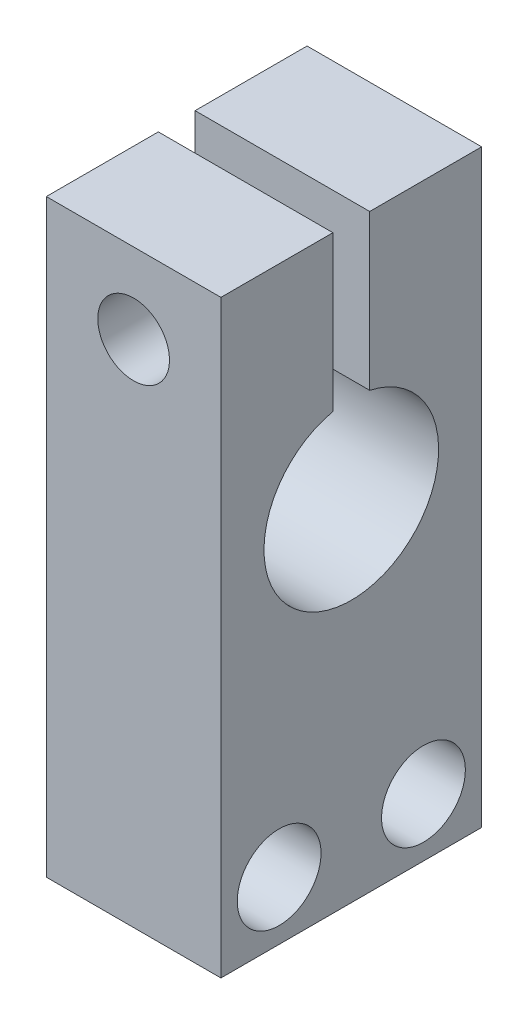
ISO-10303-21;
HEADER;
FILE_DESCRIPTION(('STEP AP214'),'2;1');
FILE_NAME('part.step','',(''),(''),'','','');
FILE_SCHEMA(('AUTOMOTIVE_DESIGN { 1 0 10303 214 1 1 1 1 }'));
ENDSEC;
DATA;
#1=APPLICATION_CONTEXT('core data for automotive mechanical design processes');
#2=APPLICATION_PROTOCOL_DEFINITION('international standard','automotive_design',2000,#1);
#3=PRODUCT_CONTEXT('',#1,'mechanical');
#4=PRODUCT('Part','Part','',(#3));
#5=PRODUCT_RELATED_PRODUCT_CATEGORY('part','',(#4));
#6=PRODUCT_DEFINITION_FORMATION('','',#4);
#7=PRODUCT_DEFINITION_CONTEXT('part definition',#1,'design');
#8=PRODUCT_DEFINITION('design','',#6,#7);
#9=PRODUCT_DEFINITION_SHAPE('','',#8);
#10=(LENGTH_UNIT() NAMED_UNIT(*) SI_UNIT(.MILLI.,.METRE.));
#11=(NAMED_UNIT(*) PLANE_ANGLE_UNIT() SI_UNIT($,.RADIAN.));
#12=(NAMED_UNIT(*) SI_UNIT($,.STERADIAN.) SOLID_ANGLE_UNIT());
#13=UNCERTAINTY_MEASURE_WITH_UNIT(LENGTH_MEASURE(1.E-05),#10,'distance_accuracy_value','');
#14=(GEOMETRIC_REPRESENTATION_CONTEXT(3) GLOBAL_UNCERTAINTY_ASSIGNED_CONTEXT((#13)) GLOBAL_UNIT_ASSIGNED_CONTEXT((#10,
#11,#12)) REPRESENTATION_CONTEXT('',''));
#15=CARTESIAN_POINT('',(0.,0.,0.));
#16=DIRECTION('',(0.,0.,1.));
#17=DIRECTION('',(1.,0.,0.));
#18=AXIS2_PLACEMENT_3D('',#15,#16,#17);
#19=CARTESIAN_POINT('',(-4.7625,13.1064,-15.875));
#20=DIRECTION('',(0.,1.,0.));
#21=DIRECTION('',(0.,0.,1.));
#22=AXIS2_PLACEMENT_3D('',#19,#20,#21);
#23=PLANE('',#22);
#24=DIRECTION('',(-1.,0.,0.));
#25=VECTOR('',#24,1.);
#26=CARTESIAN_POINT('',(4.7625,13.1064,7.112));
#27=LINE('',#26,#25);
#28=CARTESIAN_POINT('',(4.7625,13.1064,7.112));
#29=VERTEX_POINT('',#28);
#30=CARTESIAN_POINT('',(-4.7625,13.1064,7.112));
#31=VERTEX_POINT('',#30);
#32=EDGE_CURVE('E169',#29,#31,#27,.T.);
#33=ORIENTED_EDGE('',*,*,#32,.F.);
#34=DIRECTION('',(0.,0.,1.));
#35=VECTOR('',#34,1.);
#36=CARTESIAN_POINT('',(4.7625,13.1064,-15.875));
#37=LINE('',#36,#35);
#38=CARTESIAN_POINT('',(4.7625,13.1064,1.0033));
#39=VERTEX_POINT('',#38);
#40=EDGE_CURVE('E148',#39,#29,#37,.T.);
#41=ORIENTED_EDGE('',*,*,#40,.F.);
#42=DIRECTION('',(-1.,0.,0.));
#43=VECTOR('',#42,1.);
#44=CARTESIAN_POINT('',(4.7625,13.1064,1.0033));
#45=LINE('',#44,#43);
#46=CARTESIAN_POINT('',(-4.7625,13.1064,1.0033));
#47=VERTEX_POINT('',#46);
#48=EDGE_CURVE('E121',#39,#47,#45,.T.);
#49=ORIENTED_EDGE('',*,*,#48,.T.);
#50=DIRECTION('',(0.,0.,1.));
#51=VECTOR('',#50,1.);
#52=CARTESIAN_POINT('',(-4.7625,13.1064,-15.875));
#53=LINE('',#52,#51);
#54=EDGE_CURVE('E42',#47,#31,#53,.T.);
#55=ORIENTED_EDGE('',*,*,#54,.T.);
#56=EDGE_LOOP('',(#33,#41,#49,#55));
#57=FACE_BOUND('',#56,.T.);
#58=ADVANCED_FACE('F33',(#57),#23,.T.);
#59=CARTESIAN_POINT('',(-4.7625,-19.05,15.875));
#60=DIRECTION('',(0.,-1.,0.));
#61=DIRECTION('',(0.,0.,-1.));
#62=AXIS2_PLACEMENT_3D('',#59,#60,#61);
#63=PLANE('',#62);
#64=DIRECTION('',(1.,0.,0.));
#65=VECTOR('',#64,1.);
#66=CARTESIAN_POINT('',(-4.7625,-19.05,7.112));
#67=LINE('',#66,#65);
#68=CARTESIAN_POINT('',(-4.7625,-19.05,7.112));
#69=VERTEX_POINT('',#68);
#70=CARTESIAN_POINT('',(4.7625,-19.05,7.112));
#71=VERTEX_POINT('',#70);
#72=EDGE_CURVE('E50',#69,#71,#67,.T.);
#73=ORIENTED_EDGE('',*,*,#72,.F.);
#74=DIRECTION('',(0.,0.,-1.));
#75=VECTOR('',#74,1.);
#76=CARTESIAN_POINT('',(-4.7625,-19.05,15.875));
#77=LINE('',#76,#75);
#78=CARTESIAN_POINT('',(-4.7625,-19.05,-7.112));
#79=VERTEX_POINT('',#78);
#80=EDGE_CURVE('E147',#69,#79,#77,.T.);
#81=ORIENTED_EDGE('',*,*,#80,.T.);
#82=DIRECTION('',(-1.,0.,0.));
#83=VECTOR('',#82,1.);
#84=CARTESIAN_POINT('',(4.7625,-19.05,-7.112));
#85=LINE('',#84,#83);
#86=CARTESIAN_POINT('',(4.7625,-19.05,-7.112));
#87=VERTEX_POINT('',#86);
#88=EDGE_CURVE('E139',#87,#79,#85,.T.);
#89=ORIENTED_EDGE('',*,*,#88,.F.);
#90=DIRECTION('',(0.,0.,-1.));
#91=VECTOR('',#90,1.);
#92=CARTESIAN_POINT('',(4.7625,-19.05,15.875));
#93=LINE('',#92,#91);
#94=EDGE_CURVE('E144',#71,#87,#93,.T.);
#95=ORIENTED_EDGE('',*,*,#94,.F.);
#96=EDGE_LOOP('',(#73,#81,#89,#95));
#97=FACE_BOUND('',#96,.T.);
#98=ADVANCED_FACE('F35',(#97),#63,.T.);
#99=DIRECTION('',(-1.,0.,0.));
#100=VECTOR('',#99,1.);
#101=CARTESIAN_POINT('',(4.7625,13.1064,-1.0033));
#102=LINE('',#101,#100);
#103=CARTESIAN_POINT('',(4.7625,13.1064,-1.0033));
#104=VERTEX_POINT('',#103);
#105=CARTESIAN_POINT('',(-4.7625,13.1064,-1.0033));
#106=VERTEX_POINT('',#105);
#107=EDGE_CURVE('E133',#104,#106,#102,.T.);
#108=ORIENTED_EDGE('',*,*,#107,.F.);
#109=CARTESIAN_POINT('',(4.7625,13.1064,-7.112));
#110=VERTEX_POINT('',#109);
#111=EDGE_CURVE('E37',#110,#104,#37,.T.);
#112=ORIENTED_EDGE('',*,*,#111,.F.);
#113=DIRECTION('',(-1.,0.,0.));
#114=VECTOR('',#113,1.);
#115=CARTESIAN_POINT('',(4.7625,13.1064,-7.112));
#116=LINE('',#115,#114);
#117=CARTESIAN_POINT('',(-4.7625,13.1064,-7.112));
#118=VERTEX_POINT('',#117);
#119=EDGE_CURVE('E141',#110,#118,#116,.T.);
#120=ORIENTED_EDGE('',*,*,#119,.T.);
#121=EDGE_CURVE('E11',#118,#106,#53,.T.);
#122=ORIENTED_EDGE('',*,*,#121,.T.);
#123=EDGE_LOOP('',(#108,#112,#120,#122));
#124=FACE_BOUND('',#123,.T.);
#125=ADVANCED_FACE('F154',(#124),#23,.T.);
#126=CARTESIAN_POINT('',(-4.7625,0.,0.));
#127=DIRECTION('',(1.,0.,0.));
#128=DIRECTION('',(0.,0.,-1.));
#129=AXIS2_PLACEMENT_3D('',#126,#127,#128);
#130=PLANE('',#129);
#131=CARTESIAN_POINT('',(-4.7625,-15.875,-3.937));
#132=DIRECTION('',(1.,0.,0.));
#133=DIRECTION('',(0.,0.,-1.));
#134=AXIS2_PLACEMENT_3D('',#131,#132,#133);
#135=CIRCLE('',#134,2.286);
#136=CARTESIAN_POINT('',(-4.7625,-15.875,-6.223));
#137=VERTEX_POINT('',#136);
#138=EDGE_CURVE('E234',#137,#137,#135,.T.);
#139=ORIENTED_EDGE('',*,*,#138,.T.);
#140=EDGE_LOOP('',(#139));
#141=FACE_BOUND('',#140,.T.);
#142=CARTESIAN_POINT('',(-4.7625,-15.875,3.937));
#143=DIRECTION('',(1.,0.,0.));
#144=DIRECTION('',(0.,0.,-1.));
#145=AXIS2_PLACEMENT_3D('',#142,#143,#144);
#146=CIRCLE('',#145,2.286);
#147=CARTESIAN_POINT('',(-4.7625,-15.875,1.651));
#148=VERTEX_POINT('',#147);
#149=EDGE_CURVE('E244',#148,#148,#146,.T.);
#150=ORIENTED_EDGE('',*,*,#149,.T.);
#151=EDGE_LOOP('',(#150));
#152=FACE_BOUND('',#151,.T.);
#153=DIRECTION('',(0.,1.,0.));
#154=VECTOR('',#153,1.);
#155=CARTESIAN_POINT('',(-4.7625,4.65561976110591,1.0033));
#156=LINE('',#155,#154);
#157=CARTESIAN_POINT('',(-4.7625,4.65561976110591,1.0033));
#158=VERTEX_POINT('',#157);
#159=EDGE_CURVE('E126',#158,#47,#156,.T.);
#160=ORIENTED_EDGE('',*,*,#159,.F.);
#161=CARTESIAN_POINT('',(-4.7625,0.,0.));
#162=DIRECTION('',(1.,0.,0.));
#163=DIRECTION('',(0.,0.,-1.));
#164=AXIS2_PLACEMENT_3D('',#161,#162,#163);
#165=CIRCLE('',#164,4.7625);
#166=CARTESIAN_POINT('',(-4.7625,4.65561976110591,-1.0033));
#167=VERTEX_POINT('',#166);
#168=EDGE_CURVE('E101',#158,#167,#165,.T.);
#169=ORIENTED_EDGE('',*,*,#168,.T.);
#170=DIRECTION('',(0.,-1.,0.));
#171=VECTOR('',#170,1.);
#172=CARTESIAN_POINT('',(-4.7625,13.1064,-1.0033));
#173=LINE('',#172,#171);
#174=EDGE_CURVE('E122',#106,#167,#173,.T.);
#175=ORIENTED_EDGE('',*,*,#174,.F.);
#176=ORIENTED_EDGE('',*,*,#121,.F.);
#177=DIRECTION('',(0.,1.,0.));
#178=VECTOR('',#177,1.);
#179=CARTESIAN_POINT('',(-4.7625,-19.05,-7.112));
#180=LINE('',#179,#178);
#181=EDGE_CURVE('E105',#79,#118,#180,.T.);
#182=ORIENTED_EDGE('',*,*,#181,.F.);
#183=ORIENTED_EDGE('',*,*,#80,.F.);
#184=DIRECTION('',(0.,-1.,0.));
#185=VECTOR('',#184,1.);
#186=CARTESIAN_POINT('',(-4.7625,13.1064,7.112));
#187=LINE('',#186,#185);
#188=EDGE_CURVE('E163',#31,#69,#187,.T.);
#189=ORIENTED_EDGE('',*,*,#188,.F.);
#190=ORIENTED_EDGE('',*,*,#54,.F.);
#191=EDGE_LOOP('',(#160,#169,#175,#176,#182,#183,#189,#190));
#192=FACE_BOUND('',#191,.T.);
#193=ADVANCED_FACE('F160',(#141,#152,#192),#130,.F.);
#194=CARTESIAN_POINT('',(4.7625,0.,0.));
#195=DIRECTION('',(1.,0.,0.));
#196=DIRECTION('',(0.,0.,-1.));
#197=AXIS2_PLACEMENT_3D('',#194,#195,#196);
#198=PLANE('',#197);
#199=CARTESIAN_POINT('',(4.7625,-15.875,-3.937));
#200=DIRECTION('',(1.,0.,0.));
#201=DIRECTION('',(0.,0.,-1.));
#202=AXIS2_PLACEMENT_3D('',#199,#200,#201);
#203=CIRCLE('',#202,2.28599999999999);
#204=CARTESIAN_POINT('',(4.7625,-15.875,-6.22299999999999));
#205=VERTEX_POINT('',#204);
#206=EDGE_CURVE('E237',#205,#205,#203,.T.);
#207=ORIENTED_EDGE('',*,*,#206,.F.);
#208=EDGE_LOOP('',(#207));
#209=FACE_BOUND('',#208,.T.);
#210=CARTESIAN_POINT('',(4.7625,-15.875,3.937));
#211=DIRECTION('',(1.,0.,0.));
#212=DIRECTION('',(0.,0.,-1.));
#213=AXIS2_PLACEMENT_3D('',#210,#211,#212);
#214=CIRCLE('',#213,2.28599999999999);
#215=CARTESIAN_POINT('',(4.7625,-15.875,1.65100000000002));
#216=VERTEX_POINT('',#215);
#217=EDGE_CURVE('E239',#216,#216,#214,.T.);
#218=ORIENTED_EDGE('',*,*,#217,.F.);
#219=EDGE_LOOP('',(#218));
#220=FACE_BOUND('',#219,.T.);
#221=CARTESIAN_POINT('',(4.7625,0.,0.));
#222=DIRECTION('',(1.,0.,0.));
#223=DIRECTION('',(0.,0.,-1.));
#224=AXIS2_PLACEMENT_3D('',#221,#222,#223);
#225=CIRCLE('',#224,4.7625);
#226=CARTESIAN_POINT('',(4.7625,4.65561976110591,1.0033));
#227=VERTEX_POINT('',#226);
#228=CARTESIAN_POINT('',(4.7625,4.6556197611059,-1.0033));
#229=VERTEX_POINT('',#228);
#230=EDGE_CURVE('E58',#227,#229,#225,.T.);
#231=ORIENTED_EDGE('',*,*,#230,.F.);
#232=DIRECTION('',(0.,1.,0.));
#233=VECTOR('',#232,1.);
#234=CARTESIAN_POINT('',(4.7625,4.65561976110591,1.0033));
#235=LINE('',#234,#233);
#236=EDGE_CURVE('E113',#227,#39,#235,.T.);
#237=ORIENTED_EDGE('',*,*,#236,.T.);
#238=ORIENTED_EDGE('',*,*,#40,.T.);
#239=DIRECTION('',(0.,-1.,0.));
#240=VECTOR('',#239,1.);
#241=CARTESIAN_POINT('',(4.7625,13.1064,7.112));
#242=LINE('',#241,#240);
#243=EDGE_CURVE('E165',#29,#71,#242,.T.);
#244=ORIENTED_EDGE('',*,*,#243,.T.);
#245=ORIENTED_EDGE('',*,*,#94,.T.);
#246=DIRECTION('',(0.,1.,0.));
#247=VECTOR('',#246,1.);
#248=CARTESIAN_POINT('',(4.7625,-19.05,-7.112));
#249=LINE('',#248,#247);
#250=EDGE_CURVE('E136',#87,#110,#249,.T.);
#251=ORIENTED_EDGE('',*,*,#250,.T.);
#252=ORIENTED_EDGE('',*,*,#111,.T.);
#253=DIRECTION('',(0.,-1.,0.));
#254=VECTOR('',#253,1.);
#255=CARTESIAN_POINT('',(4.7625,13.1064,-1.0033));
#256=LINE('',#255,#254);
#257=EDGE_CURVE('E116',#104,#229,#256,.T.);
#258=ORIENTED_EDGE('',*,*,#257,.T.);
#259=EDGE_LOOP('',(#231,#237,#238,#244,#245,#251,#252,#258));
#260=FACE_BOUND('',#259,.T.);
#261=ADVANCED_FACE('F111',(#209,#220,#260),#198,.T.);
#262=CARTESIAN_POINT('',(4.7625,-19.05,-7.112));
#263=DIRECTION('',(0.,0.,1.));
#264=DIRECTION('',(1.,0.,0.));
#265=AXIS2_PLACEMENT_3D('',#262,#263,#264);
#266=PLANE('',#265);
#267=CARTESIAN_POINT('',(0.,8.7376,-7.112));
#268=DIRECTION('',(0.,0.,-1.));
#269=DIRECTION('',(-1.,0.,0.));
#270=AXIS2_PLACEMENT_3D('',#267,#268,#269);
#271=CIRCLE('',#270,3.56869999999999);
#272=CARTESIAN_POINT('',(-3.56869999999999,8.7376,-7.112));
#273=VERTEX_POINT('',#272);
#274=EDGE_CURVE('E247',#273,#273,#271,.T.);
#275=ORIENTED_EDGE('',*,*,#274,.F.);
#276=EDGE_LOOP('',(#275));
#277=FACE_BOUND('',#276,.T.);
#278=ORIENTED_EDGE('',*,*,#181,.T.);
#279=ORIENTED_EDGE('',*,*,#119,.F.);
#280=ORIENTED_EDGE('',*,*,#250,.F.);
#281=ORIENTED_EDGE('',*,*,#88,.T.);
#282=EDGE_LOOP('',(#278,#279,#280,#281));
#283=FACE_BOUND('',#282,.T.);
#284=ADVANCED_FACE('F191',(#277,#283),#266,.F.);
#285=CARTESIAN_POINT('',(4.7625,4.65561976110591,1.0033));
#286=DIRECTION('',(0.,0.,1.));
#287=DIRECTION('',(1.,0.,0.));
#288=AXIS2_PLACEMENT_3D('',#285,#286,#287);
#289=PLANE('',#288);
#290=CARTESIAN_POINT('',(0.,8.7376,1.0033));
#291=DIRECTION('',(0.,0.,1.));
#292=DIRECTION('',(1.,0.,0.));
#293=AXIS2_PLACEMENT_3D('',#290,#291,#292);
#294=CIRCLE('',#293,1.95580000000001);
#295=CARTESIAN_POINT('',(1.95580000000001,8.7376,1.0033));
#296=VERTEX_POINT('',#295);
#297=EDGE_CURVE('E259',#296,#296,#294,.T.);
#298=ORIENTED_EDGE('',*,*,#297,.T.);
#299=EDGE_LOOP('',(#298));
#300=FACE_BOUND('',#299,.T.);
#301=ORIENTED_EDGE('',*,*,#159,.T.);
#302=ORIENTED_EDGE('',*,*,#48,.F.);
#303=ORIENTED_EDGE('',*,*,#236,.F.);
#304=DIRECTION('',(-1.,0.,0.));
#305=VECTOR('',#304,1.);
#306=CARTESIAN_POINT('',(4.7625,4.65561976110591,1.0033));
#307=LINE('',#306,#305);
#308=EDGE_CURVE('E98',#227,#158,#307,.T.);
#309=ORIENTED_EDGE('',*,*,#308,.T.);
#310=EDGE_LOOP('',(#301,#302,#303,#309));
#311=FACE_BOUND('',#310,.T.);
#312=ADVANCED_FACE('F119',(#300,#311),#289,.F.);
#313=CARTESIAN_POINT('',(4.7625,13.1064,-1.0033));
#314=DIRECTION('',(0.,0.,-1.));
#315=DIRECTION('',(-1.,0.,0.));
#316=AXIS2_PLACEMENT_3D('',#313,#314,#315);
#317=PLANE('',#316);
#318=CARTESIAN_POINT('',(0.,8.7376,-1.0033));
#319=DIRECTION('',(0.,0.,-1.));
#320=DIRECTION('',(-1.,0.,0.));
#321=AXIS2_PLACEMENT_3D('',#318,#319,#320);
#322=CIRCLE('',#321,1.95580000000001);
#323=CARTESIAN_POINT('',(-1.95580000000001,8.7376,-1.0033));
#324=VERTEX_POINT('',#323);
#325=EDGE_CURVE('E117',#324,#324,#322,.T.);
#326=ORIENTED_EDGE('',*,*,#325,.T.);
#327=EDGE_LOOP('',(#326));
#328=FACE_BOUND('',#327,.T.);
#329=ORIENTED_EDGE('',*,*,#174,.T.);
#330=DIRECTION('',(-1.,0.,0.));
#331=VECTOR('',#330,1.);
#332=CARTESIAN_POINT('',(4.7625,4.6556197611059,-1.0033));
#333=LINE('',#332,#331);
#334=EDGE_CURVE('E106',#229,#167,#333,.T.);
#335=ORIENTED_EDGE('',*,*,#334,.F.);
#336=ORIENTED_EDGE('',*,*,#257,.F.);
#337=ORIENTED_EDGE('',*,*,#107,.T.);
#338=EDGE_LOOP('',(#329,#335,#336,#337));
#339=FACE_BOUND('',#338,.T.);
#340=ADVANCED_FACE('F158',(#328,#339),#317,.F.);
#341=CARTESIAN_POINT('',(4.7625,13.1064,7.112));
#342=DIRECTION('',(0.,0.,-1.));
#343=DIRECTION('',(0.,1.,0.));
#344=AXIS2_PLACEMENT_3D('',#341,#342,#343);
#345=PLANE('',#344);
#346=CARTESIAN_POINT('',(0.,8.7376,7.112));
#347=DIRECTION('',(0.,0.,-1.));
#348=DIRECTION('',(-1.,0.,0.));
#349=AXIS2_PLACEMENT_3D('',#346,#347,#348);
#350=CIRCLE('',#349,1.9558);
#351=CARTESIAN_POINT('',(-1.9558,8.7376,7.112));
#352=VERTEX_POINT('',#351);
#353=EDGE_CURVE('E256',#352,#352,#350,.T.);
#354=ORIENTED_EDGE('',*,*,#353,.T.);
#355=EDGE_LOOP('',(#354));
#356=FACE_BOUND('',#355,.T.);
#357=ORIENTED_EDGE('',*,*,#72,.T.);
#358=ORIENTED_EDGE('',*,*,#243,.F.);
#359=ORIENTED_EDGE('',*,*,#32,.T.);
#360=ORIENTED_EDGE('',*,*,#188,.T.);
#361=EDGE_LOOP('',(#357,#358,#359,#360));
#362=FACE_BOUND('',#361,.T.);
#363=ADVANCED_FACE('F172',(#356,#362),#345,.F.);
#364=CARTESIAN_POINT('',(-4.7625,0.,0.));
#365=DIRECTION('',(1.,0.,0.));
#366=DIRECTION('',(0.,0.,-1.));
#367=AXIS2_PLACEMENT_3D('',#364,#365,#366);
#368=CYLINDRICAL_SURFACE('',#367,4.7625);
#369=ORIENTED_EDGE('',*,*,#230,.T.);
#370=ORIENTED_EDGE('',*,*,#334,.T.);
#371=ORIENTED_EDGE('',*,*,#168,.F.);
#372=ORIENTED_EDGE('',*,*,#308,.F.);
#373=EDGE_LOOP('',(#369,#370,#371,#372));
#374=FACE_BOUND('',#373,.T.);
#375=ADVANCED_FACE('F99',(#374),#368,.F.);
#376=CARTESIAN_POINT('',(0.,8.7376,-7.112));
#377=DIRECTION('',(0.,0.,-1.));
#378=DIRECTION('',(-1.,0.,0.));
#379=AXIS2_PLACEMENT_3D('',#376,#377,#378);
#380=CYLINDRICAL_SURFACE('',#379,1.95580000000001);
#381=ORIENTED_EDGE('',*,*,#353,.F.);
#382=EDGE_LOOP('',(#381));
#383=FACE_BOUND('',#382,.T.);
#384=ORIENTED_EDGE('',*,*,#297,.F.);
#385=EDGE_LOOP('',(#384));
#386=FACE_BOUND('',#385,.T.);
#387=ADVANCED_FACE('F210',(#383,#386),#380,.F.);
#388=CARTESIAN_POINT('',(0.,8.7376,-3.2004));
#389=DIRECTION('',(0.,0.,-1.));
#390=DIRECTION('',(-1.,0.,0.));
#391=AXIS2_PLACEMENT_3D('',#388,#389,#390);
#392=CIRCLE('',#391,1.95580000000001);
#393=CARTESIAN_POINT('',(-1.95580000000001,8.7376,-3.2004));
#394=VERTEX_POINT('',#393);
#395=EDGE_CURVE('E253',#394,#394,#392,.T.);
#396=ORIENTED_EDGE('',*,*,#395,.T.);
#397=EDGE_LOOP('',(#396));
#398=FACE_BOUND('',#397,.T.);
#399=ORIENTED_EDGE('',*,*,#325,.F.);
#400=EDGE_LOOP('',(#399));
#401=FACE_BOUND('',#400,.T.);
#402=ADVANCED_FACE('F211',(#398,#401),#380,.F.);
#403=CARTESIAN_POINT('',(1.95580000000001,8.7376,-3.2004));
#404=DIRECTION('',(0.,0.,1.));
#405=DIRECTION('',(1.,0.,0.));
#406=AXIS2_PLACEMENT_3D('',#403,#404,#405);
#407=PLANE('',#406);
#408=ORIENTED_EDGE('',*,*,#395,.F.);
#409=EDGE_LOOP('',(#408));
#410=FACE_BOUND('',#409,.T.);
#411=CARTESIAN_POINT('',(0.,8.7376,-3.2004));
#412=DIRECTION('',(0.,0.,-1.));
#413=DIRECTION('',(-1.,0.,0.));
#414=AXIS2_PLACEMENT_3D('',#411,#412,#413);
#415=CIRCLE('',#414,3.56869999999999);
#416=CARTESIAN_POINT('',(-3.56869999999999,8.7376,-3.2004));
#417=VERTEX_POINT('',#416);
#418=EDGE_CURVE('E250',#417,#417,#415,.T.);
#419=ORIENTED_EDGE('',*,*,#418,.T.);
#420=EDGE_LOOP('',(#419));
#421=FACE_BOUND('',#420,.T.);
#422=ADVANCED_FACE('F214',(#410,#421),#407,.F.);
#423=CARTESIAN_POINT('',(0.,8.7376,-7.112));
#424=DIRECTION('',(0.,0.,-1.));
#425=DIRECTION('',(-1.,0.,0.));
#426=AXIS2_PLACEMENT_3D('',#423,#424,#425);
#427=CYLINDRICAL_SURFACE('',#426,3.56869999999999);
#428=ORIENTED_EDGE('',*,*,#418,.F.);
#429=EDGE_LOOP('',(#428));
#430=FACE_BOUND('',#429,.T.);
#431=ORIENTED_EDGE('',*,*,#274,.T.);
#432=EDGE_LOOP('',(#431));
#433=FACE_BOUND('',#432,.T.);
#434=ADVANCED_FACE('F218',(#430,#433),#427,.F.);
#435=CARTESIAN_POINT('',(4.7625,-15.875,3.937));
#436=DIRECTION('',(1.,0.,0.));
#437=DIRECTION('',(0.,0.,-1.));
#438=AXIS2_PLACEMENT_3D('',#435,#436,#437);
#439=CYLINDRICAL_SURFACE('',#438,2.28599999999999);
#440=ORIENTED_EDGE('',*,*,#149,.F.);
#441=EDGE_LOOP('',(#440));
#442=FACE_BOUND('',#441,.T.);
#443=ORIENTED_EDGE('',*,*,#217,.T.);
#444=EDGE_LOOP('',(#443));
#445=FACE_BOUND('',#444,.T.);
#446=ADVANCED_FACE('F222',(#442,#445),#439,.F.);
#447=CARTESIAN_POINT('',(4.7625,-15.875,-3.937));
#448=DIRECTION('',(1.,0.,0.));
#449=DIRECTION('',(0.,0.,-1.));
#450=AXIS2_PLACEMENT_3D('',#447,#448,#449);
#451=CYLINDRICAL_SURFACE('',#450,2.28599999999999);
#452=ORIENTED_EDGE('',*,*,#138,.F.);
#453=EDGE_LOOP('',(#452));
#454=FACE_BOUND('',#453,.T.);
#455=ORIENTED_EDGE('',*,*,#206,.T.);
#456=EDGE_LOOP('',(#455));
#457=FACE_BOUND('',#456,.T.);
#458=ADVANCED_FACE('F226',(#454,#457),#451,.F.);
#459=CLOSED_SHELL('',(#58,#98,#125,#193,#261,#284,#312,#340,#363,#375,#387,#402,#422,#434,#446,#458));
#460=MANIFOLD_SOLID_BREP('B2',#459);
#461=ADVANCED_BREP_SHAPE_REPRESENTATION('',(#18,#460),#14);
#462=SHAPE_DEFINITION_REPRESENTATION(#9,#461);
ENDSEC;
END-ISO-10303-21;
